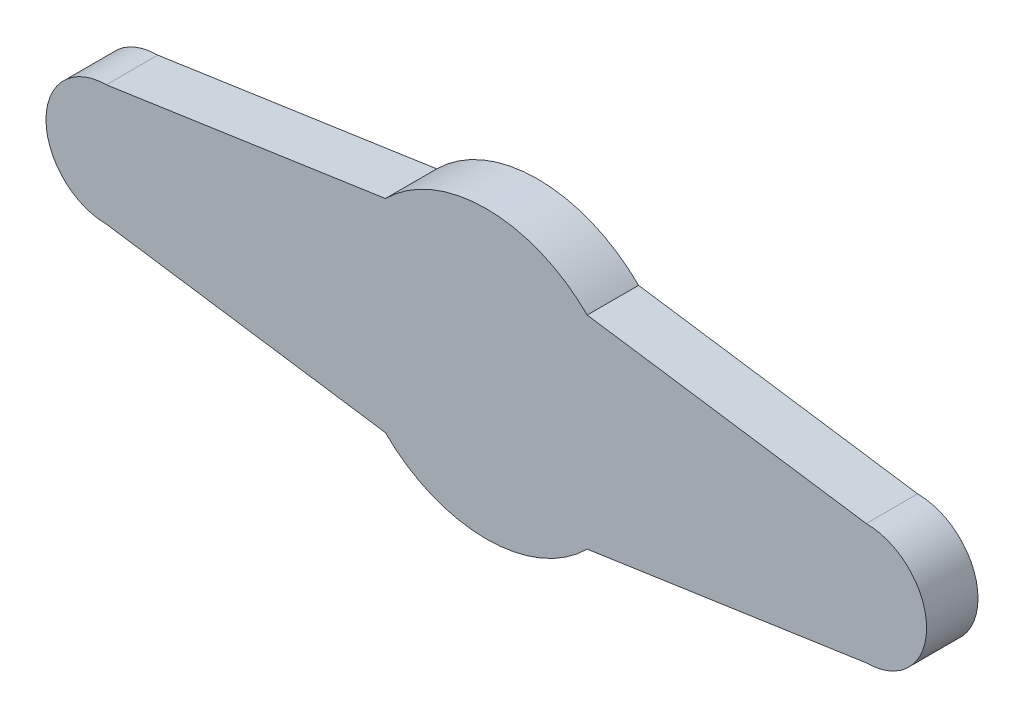
ISO-10303-21;
HEADER;
FILE_DESCRIPTION(('STEP AP214'),'2;1');
FILE_NAME('part.step','',(''),(''),'','','');
FILE_SCHEMA(('AUTOMOTIVE_DESIGN { 1 0 10303 214 1 1 1 1 }'));
ENDSEC;
DATA;
#1=APPLICATION_CONTEXT('core data for automotive mechanical design processes');
#2=APPLICATION_PROTOCOL_DEFINITION('international standard','automotive_design',2000,#1);
#3=PRODUCT_CONTEXT('',#1,'mechanical');
#4=PRODUCT('Part','Part','',(#3));
#5=PRODUCT_RELATED_PRODUCT_CATEGORY('part','',(#4));
#6=PRODUCT_DEFINITION_FORMATION('','',#4);
#7=PRODUCT_DEFINITION_CONTEXT('part definition',#1,'design');
#8=PRODUCT_DEFINITION('design','',#6,#7);
#9=PRODUCT_DEFINITION_SHAPE('','',#8);
#10=(LENGTH_UNIT() NAMED_UNIT(*) SI_UNIT(.MILLI.,.METRE.));
#11=(NAMED_UNIT(*) PLANE_ANGLE_UNIT() SI_UNIT($,.RADIAN.));
#12=(NAMED_UNIT(*) SI_UNIT($,.STERADIAN.) SOLID_ANGLE_UNIT());
#13=UNCERTAINTY_MEASURE_WITH_UNIT(LENGTH_MEASURE(1.E-05),#10,'distance_accuracy_value','');
#14=(GEOMETRIC_REPRESENTATION_CONTEXT(3) GLOBAL_UNCERTAINTY_ASSIGNED_CONTEXT((#13)) GLOBAL_UNIT_ASSIGNED_CONTEXT((#10,
#11,#12)) REPRESENTATION_CONTEXT('',''));
#15=CARTESIAN_POINT('',(0.,0.,0.));
#16=DIRECTION('',(0.,0.,1.));
#17=DIRECTION('',(1.,0.,0.));
#18=AXIS2_PLACEMENT_3D('',#15,#16,#17);
#19=CARTESIAN_POINT('',(0.748518204911092,-5.08992379339543,2.3));
#20=DIRECTION('',(0.145493990494831,-0.989359135364853,0.));
#21=DIRECTION('',(0.989359135364853,0.145493990494831,0.));
#22=AXIS2_PLACEMENT_3D('',#19,#20,#21);
#23=PLANE('',#22);
#24=DIRECTION('',(-0.989359135364853,-0.145493990494831,0.));
#25=VECTOR('',#24,1.);
#26=CARTESIAN_POINT('',(0.748518204911092,-5.08992379339543,0.));
#27=LINE('',#26,#25);
#28=CARTESIAN_POINT('',(17.,-2.7,0.));
#29=VERTEX_POINT('',#28);
#30=CARTESIAN_POINT('',(4.51489762889421,-4.53604446633909,0.));
#31=VERTEX_POINT('',#30);
#32=EDGE_CURVE('E128',#29,#31,#27,.T.);
#33=ORIENTED_EDGE('',*,*,#32,.F.);
#34=DIRECTION('',(0.,0.,-1.));
#35=VECTOR('',#34,1.);
#36=CARTESIAN_POINT('',(17.,-2.7,2.3));
#37=LINE('',#36,#35);
#38=CARTESIAN_POINT('',(17.,-2.7,2.3));
#39=VERTEX_POINT('',#38);
#40=EDGE_CURVE('E11',#39,#29,#37,.T.);
#41=ORIENTED_EDGE('',*,*,#40,.F.);
#42=DIRECTION('',(-0.989359135364853,-0.145493990494831,0.));
#43=VECTOR('',#42,1.);
#44=CARTESIAN_POINT('',(0.748518204911092,-5.08992379339543,2.3));
#45=LINE('',#44,#43);
#46=CARTESIAN_POINT('',(4.51489762889421,-4.53604446633909,2.3));
#47=VERTEX_POINT('',#46);
#48=EDGE_CURVE('E146',#39,#47,#45,.T.);
#49=ORIENTED_EDGE('',*,*,#48,.T.);
#50=DIRECTION('',(0.,0.,-1.));
#51=VECTOR('',#50,1.);
#52=CARTESIAN_POINT('',(4.51489762889421,-4.53604446633909,2.3));
#53=LINE('',#52,#51);
#54=EDGE_CURVE('E88',#47,#31,#53,.T.);
#55=ORIENTED_EDGE('',*,*,#54,.T.);
#56=EDGE_LOOP('',(#33,#41,#49,#55));
#57=FACE_BOUND('',#56,.T.);
#58=ADVANCED_FACE('F37',(#57),#23,.T.);
#59=CARTESIAN_POINT('',(17.,0.,2.3));
#60=DIRECTION('',(0.,0.,-1.));
#61=DIRECTION('',(-1.,0.,0.));
#62=AXIS2_PLACEMENT_3D('',#59,#60,#61);
#63=CYLINDRICAL_SURFACE('',#62,2.7);
#64=CARTESIAN_POINT('',(17.,0.,0.));
#65=DIRECTION('',(0.,0.,1.));
#66=DIRECTION('',(1.,0.,0.));
#67=AXIS2_PLACEMENT_3D('',#64,#65,#66);
#68=CIRCLE('',#67,2.7);
#69=CARTESIAN_POINT('',(17.,2.7,0.));
#70=VERTEX_POINT('',#69);
#71=EDGE_CURVE('E131',#70,#29,#68,.F.);
#72=ORIENTED_EDGE('',*,*,#71,.F.);
#73=DIRECTION('',(0.,0.,-1.));
#74=VECTOR('',#73,1.);
#75=CARTESIAN_POINT('',(17.,2.7,2.3));
#76=LINE('',#75,#74);
#77=CARTESIAN_POINT('',(17.,2.7,2.3));
#78=VERTEX_POINT('',#77);
#79=EDGE_CURVE('E45',#78,#70,#76,.T.);
#80=ORIENTED_EDGE('',*,*,#79,.F.);
#81=CARTESIAN_POINT('',(17.,0.,2.3));
#82=DIRECTION('',(0.,0.,1.));
#83=DIRECTION('',(1.,0.,0.));
#84=AXIS2_PLACEMENT_3D('',#81,#82,#83);
#85=CIRCLE('',#84,2.7);
#86=EDGE_CURVE('E168',#78,#39,#85,.F.);
#87=ORIENTED_EDGE('',*,*,#86,.T.);
#88=ORIENTED_EDGE('',*,*,#40,.T.);
#89=EDGE_LOOP('',(#72,#80,#87,#88));
#90=FACE_BOUND('',#89,.T.);
#91=ADVANCED_FACE('F167',(#90),#63,.T.);
#92=CARTESIAN_POINT('',(0.748518204911092,5.08992379339543,2.3));
#93=DIRECTION('',(-0.145493990494831,-0.989359135364853,0.));
#94=DIRECTION('',(0.989359135364853,-0.145493990494831,0.));
#95=AXIS2_PLACEMENT_3D('',#92,#93,#94);
#96=PLANE('',#95);
#97=DIRECTION('',(-0.989359135364853,0.145493990494831,0.));
#98=VECTOR('',#97,1.);
#99=CARTESIAN_POINT('',(0.748518204911092,5.08992379339543,0.));
#100=LINE('',#99,#98);
#101=CARTESIAN_POINT('',(4.51489762889421,4.53604446633909,0.));
#102=VERTEX_POINT('',#101);
#103=EDGE_CURVE('E134',#70,#102,#100,.T.);
#104=ORIENTED_EDGE('',*,*,#103,.T.);
#105=DIRECTION('',(0.,0.,-1.));
#106=VECTOR('',#105,1.);
#107=CARTESIAN_POINT('',(4.51489762889421,4.53604446633909,2.3));
#108=LINE('',#107,#106);
#109=CARTESIAN_POINT('',(4.51489762889421,4.53604446633909,2.3));
#110=VERTEX_POINT('',#109);
#111=EDGE_CURVE('E152',#110,#102,#108,.T.);
#112=ORIENTED_EDGE('',*,*,#111,.F.);
#113=DIRECTION('',(-0.989359135364853,0.145493990494831,0.));
#114=VECTOR('',#113,1.);
#115=CARTESIAN_POINT('',(0.748518204911092,5.08992379339543,2.3));
#116=LINE('',#115,#114);
#117=EDGE_CURVE('E159',#78,#110,#116,.T.);
#118=ORIENTED_EDGE('',*,*,#117,.F.);
#119=ORIENTED_EDGE('',*,*,#79,.T.);
#120=EDGE_LOOP('',(#104,#112,#118,#119));
#121=FACE_BOUND('',#120,.T.);
#122=ADVANCED_FACE('F157',(#121),#96,.F.);
#123=CARTESIAN_POINT('',(0.,0.,2.3));
#124=DIRECTION('',(0.,0.,-1.));
#125=DIRECTION('',(-1.,0.,0.));
#126=AXIS2_PLACEMENT_3D('',#123,#124,#125);
#127=CYLINDRICAL_SURFACE('',#126,6.4);
#128=CARTESIAN_POINT('',(0.,0.,0.));
#129=DIRECTION('',(0.,0.,1.));
#130=DIRECTION('',(1.,0.,0.));
#131=AXIS2_PLACEMENT_3D('',#128,#129,#130);
#132=CIRCLE('',#131,6.4);
#133=CARTESIAN_POINT('',(-4.51489762889421,4.53604446633909,0.));
#134=VERTEX_POINT('',#133);
#135=EDGE_CURVE('E136',#102,#134,#132,.T.);
#136=ORIENTED_EDGE('',*,*,#135,.T.);
#137=DIRECTION('',(0.,0.,-1.));
#138=VECTOR('',#137,1.);
#139=CARTESIAN_POINT('',(-4.51489762889421,4.53604446633909,2.3));
#140=LINE('',#139,#138);
#141=CARTESIAN_POINT('',(-4.51489762889421,4.53604446633909,2.3));
#142=VERTEX_POINT('',#141);
#143=EDGE_CURVE('E150',#142,#134,#140,.T.);
#144=ORIENTED_EDGE('',*,*,#143,.F.);
#145=CARTESIAN_POINT('',(0.,0.,2.3));
#146=DIRECTION('',(0.,0.,1.));
#147=DIRECTION('',(1.,0.,0.));
#148=AXIS2_PLACEMENT_3D('',#145,#146,#147);
#149=CIRCLE('',#148,6.4);
#150=EDGE_CURVE('E176',#110,#142,#149,.T.);
#151=ORIENTED_EDGE('',*,*,#150,.F.);
#152=ORIENTED_EDGE('',*,*,#111,.T.);
#153=EDGE_LOOP('',(#136,#144,#151,#152));
#154=FACE_BOUND('',#153,.T.);
#155=ADVANCED_FACE('F183',(#154),#127,.T.);
#156=CARTESIAN_POINT('',(-0.748518204911092,5.08992379339543,2.3));
#157=DIRECTION('',(-0.145493990494831,0.989359135364853,0.));
#158=DIRECTION('',(-0.989359135364853,-0.145493990494831,0.));
#159=AXIS2_PLACEMENT_3D('',#156,#157,#158);
#160=PLANE('',#159);
#161=DIRECTION('',(0.989359135364853,0.145493990494831,0.));
#162=VECTOR('',#161,1.);
#163=CARTESIAN_POINT('',(-0.748518204911092,5.08992379339543,0.));
#164=LINE('',#163,#162);
#165=CARTESIAN_POINT('',(-17.,2.7,0.));
#166=VERTEX_POINT('',#165);
#167=EDGE_CURVE('E139',#166,#134,#164,.T.);
#168=ORIENTED_EDGE('',*,*,#167,.F.);
#169=DIRECTION('',(0.,0.,-1.));
#170=VECTOR('',#169,1.);
#171=CARTESIAN_POINT('',(-17.,2.7,2.3));
#172=LINE('',#171,#170);
#173=CARTESIAN_POINT('',(-17.,2.7,2.3));
#174=VERTEX_POINT('',#173);
#175=EDGE_CURVE('E120',#174,#166,#172,.T.);
#176=ORIENTED_EDGE('',*,*,#175,.F.);
#177=DIRECTION('',(0.989359135364853,0.145493990494831,0.));
#178=VECTOR('',#177,1.);
#179=CARTESIAN_POINT('',(-0.748518204911092,5.08992379339543,2.3));
#180=LINE('',#179,#178);
#181=EDGE_CURVE('E113',#174,#142,#180,.T.);
#182=ORIENTED_EDGE('',*,*,#181,.T.);
#183=ORIENTED_EDGE('',*,*,#143,.T.);
#184=EDGE_LOOP('',(#168,#176,#182,#183));
#185=FACE_BOUND('',#184,.T.);
#186=ADVANCED_FACE('F179',(#185),#160,.T.);
#187=CARTESIAN_POINT('',(-17.,0.,2.3));
#188=DIRECTION('',(0.,0.,-1.));
#189=DIRECTION('',(-1.,0.,0.));
#190=AXIS2_PLACEMENT_3D('',#187,#188,#189);
#191=CYLINDRICAL_SURFACE('',#190,2.7);
#192=CARTESIAN_POINT('',(-17.,0.,0.));
#193=DIRECTION('',(0.,0.,1.));
#194=DIRECTION('',(1.,0.,0.));
#195=AXIS2_PLACEMENT_3D('',#192,#193,#194);
#196=CIRCLE('',#195,2.7);
#197=CARTESIAN_POINT('',(-17.,-2.7,0.));
#198=VERTEX_POINT('',#197);
#199=EDGE_CURVE('E119',#166,#198,#196,.T.);
#200=ORIENTED_EDGE('',*,*,#199,.T.);
#201=DIRECTION('',(0.,0.,-1.));
#202=VECTOR('',#201,1.);
#203=CARTESIAN_POINT('',(-17.,-2.7,2.3));
#204=LINE('',#203,#202);
#205=CARTESIAN_POINT('',(-17.,-2.7,2.3));
#206=VERTEX_POINT('',#205);
#207=EDGE_CURVE('E116',#206,#198,#204,.T.);
#208=ORIENTED_EDGE('',*,*,#207,.F.);
#209=CARTESIAN_POINT('',(-17.,0.,2.3));
#210=DIRECTION('',(0.,0.,1.));
#211=DIRECTION('',(1.,0.,0.));
#212=AXIS2_PLACEMENT_3D('',#209,#210,#211);
#213=CIRCLE('',#212,2.7);
#214=EDGE_CURVE('E107',#174,#206,#213,.T.);
#215=ORIENTED_EDGE('',*,*,#214,.F.);
#216=ORIENTED_EDGE('',*,*,#175,.T.);
#217=EDGE_LOOP('',(#200,#208,#215,#216));
#218=FACE_BOUND('',#217,.T.);
#219=ADVANCED_FACE('F117',(#218),#191,.T.);
#220=CARTESIAN_POINT('',(-0.748518204911092,-5.08992379339543,2.3));
#221=DIRECTION('',(0.145493990494831,0.989359135364853,0.));
#222=DIRECTION('',(-0.989359135364853,0.145493990494831,0.));
#223=AXIS2_PLACEMENT_3D('',#220,#221,#222);
#224=PLANE('',#223);
#225=DIRECTION('',(0.989359135364853,-0.145493990494831,0.));
#226=VECTOR('',#225,1.);
#227=CARTESIAN_POINT('',(-0.748518204911092,-5.08992379339543,0.));
#228=LINE('',#227,#226);
#229=CARTESIAN_POINT('',(-4.51489762889421,-4.53604446633909,0.));
#230=VERTEX_POINT('',#229);
#231=EDGE_CURVE('E81',#198,#230,#228,.T.);
#232=ORIENTED_EDGE('',*,*,#231,.T.);
#233=DIRECTION('',(0.,0.,-1.));
#234=VECTOR('',#233,1.);
#235=CARTESIAN_POINT('',(-4.51489762889421,-4.53604446633909,2.3));
#236=LINE('',#235,#234);
#237=CARTESIAN_POINT('',(-4.51489762889421,-4.53604446633909,2.3));
#238=VERTEX_POINT('',#237);
#239=EDGE_CURVE('E121',#238,#230,#236,.T.);
#240=ORIENTED_EDGE('',*,*,#239,.F.);
#241=DIRECTION('',(0.989359135364853,-0.145493990494831,0.));
#242=VECTOR('',#241,1.);
#243=CARTESIAN_POINT('',(-0.748518204911092,-5.08992379339543,2.3));
#244=LINE('',#243,#242);
#245=EDGE_CURVE('E111',#206,#238,#244,.T.);
#246=ORIENTED_EDGE('',*,*,#245,.F.);
#247=ORIENTED_EDGE('',*,*,#207,.T.);
#248=EDGE_LOOP('',(#232,#240,#246,#247));
#249=FACE_BOUND('',#248,.T.);
#250=ADVANCED_FACE('F123',(#249),#224,.F.);
#251=CARTESIAN_POINT('',(0.,0.,2.3));
#252=DIRECTION('',(0.,0.,-1.));
#253=DIRECTION('',(-1.,0.,0.));
#254=AXIS2_PLACEMENT_3D('',#251,#252,#253);
#255=CYLINDRICAL_SURFACE('',#254,6.4);
#256=CARTESIAN_POINT('',(0.,0.,0.));
#257=DIRECTION('',(0.,0.,1.));
#258=DIRECTION('',(1.,0.,0.));
#259=AXIS2_PLACEMENT_3D('',#256,#257,#258);
#260=CIRCLE('',#259,6.4);
#261=EDGE_CURVE('E144',#230,#31,#260,.T.);
#262=ORIENTED_EDGE('',*,*,#261,.T.);
#263=ORIENTED_EDGE('',*,*,#54,.F.);
#264=CARTESIAN_POINT('',(0.,0.,2.3));
#265=DIRECTION('',(0.,0.,1.));
#266=DIRECTION('',(1.,0.,0.));
#267=AXIS2_PLACEMENT_3D('',#264,#265,#266);
#268=CIRCLE('',#267,6.4);
#269=EDGE_CURVE('E53',#238,#47,#268,.T.);
#270=ORIENTED_EDGE('',*,*,#269,.F.);
#271=ORIENTED_EDGE('',*,*,#239,.T.);
#272=EDGE_LOOP('',(#262,#263,#270,#271));
#273=FACE_BOUND('',#272,.T.);
#274=ADVANCED_FACE('F171',(#273),#255,.T.);
#275=CARTESIAN_POINT('',(0.,0.,2.3));
#276=DIRECTION('',(0.,0.,1.));
#277=DIRECTION('',(1.,0.,0.));
#278=AXIS2_PLACEMENT_3D('',#275,#276,#277);
#279=PLANE('',#278);
#280=ORIENTED_EDGE('',*,*,#48,.F.);
#281=ORIENTED_EDGE('',*,*,#86,.F.);
#282=ORIENTED_EDGE('',*,*,#117,.T.);
#283=ORIENTED_EDGE('',*,*,#150,.T.);
#284=ORIENTED_EDGE('',*,*,#181,.F.);
#285=ORIENTED_EDGE('',*,*,#214,.T.);
#286=ORIENTED_EDGE('',*,*,#245,.T.);
#287=ORIENTED_EDGE('',*,*,#269,.T.);
#288=EDGE_LOOP('',(#280,#281,#282,#283,#284,#285,#286,#287));
#289=FACE_BOUND('',#288,.T.);
#290=ADVANCED_FACE('F109',(#289),#279,.T.);
#291=CARTESIAN_POINT('',(0.,0.,0.));
#292=DIRECTION('',(0.,0.,1.));
#293=DIRECTION('',(1.,0.,0.));
#294=AXIS2_PLACEMENT_3D('',#291,#292,#293);
#295=PLANE('',#294);
#296=ORIENTED_EDGE('',*,*,#32,.T.);
#297=ORIENTED_EDGE('',*,*,#261,.F.);
#298=ORIENTED_EDGE('',*,*,#231,.F.);
#299=ORIENTED_EDGE('',*,*,#199,.F.);
#300=ORIENTED_EDGE('',*,*,#167,.T.);
#301=ORIENTED_EDGE('',*,*,#135,.F.);
#302=ORIENTED_EDGE('',*,*,#103,.F.);
#303=ORIENTED_EDGE('',*,*,#71,.T.);
#304=EDGE_LOOP('',(#296,#297,#298,#299,#300,#301,#302,#303));
#305=FACE_BOUND('',#304,.T.);
#306=ADVANCED_FACE('F166',(#305),#295,.F.);
#307=CLOSED_SHELL('',(#58,#91,#122,#155,#186,#219,#250,#274,#290,#306));
#308=MANIFOLD_SOLID_BREP('B2',#307);
#309=ADVANCED_BREP_SHAPE_REPRESENTATION('',(#18,#308),#14);
#310=SHAPE_DEFINITION_REPRESENTATION(#9,#309);
ENDSEC;
END-ISO-10303-21;
